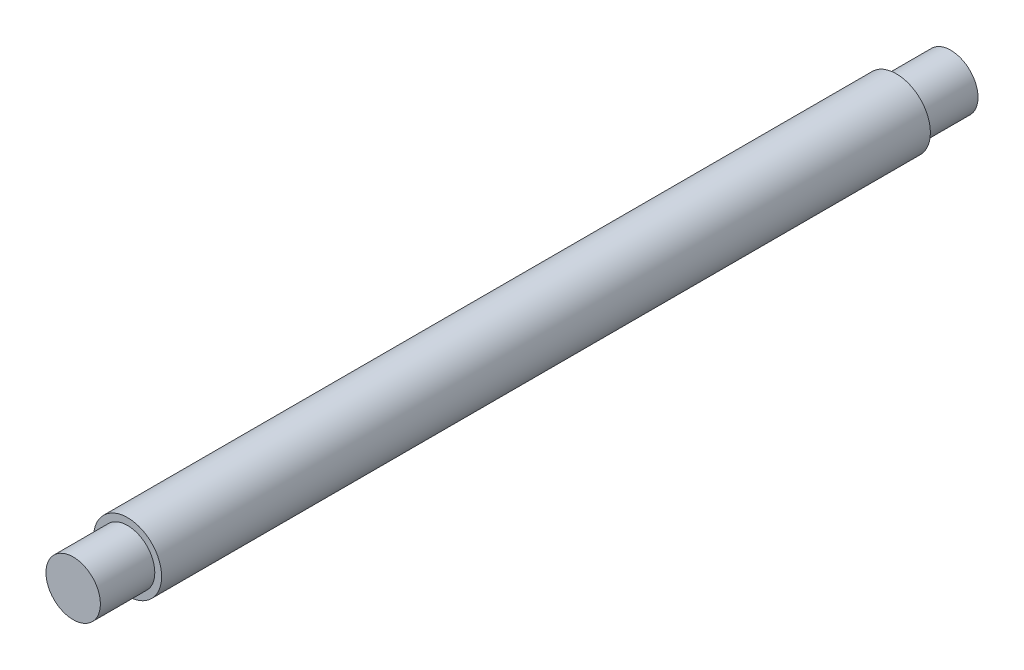
ISO-10303-21;
HEADER;
FILE_DESCRIPTION(('STEP AP214'),'2;1');
FILE_NAME('part.step','',(''),(''),'','','');
FILE_SCHEMA(('AUTOMOTIVE_DESIGN { 1 0 10303 214 1 1 1 1 }'));
ENDSEC;
DATA;
#1=APPLICATION_CONTEXT('core data for automotive mechanical design processes');
#2=APPLICATION_PROTOCOL_DEFINITION('international standard','automotive_design',2000,#1);
#3=PRODUCT_CONTEXT('',#1,'mechanical');
#4=PRODUCT('Part','Part','',(#3));
#5=PRODUCT_RELATED_PRODUCT_CATEGORY('part','',(#4));
#6=PRODUCT_DEFINITION_FORMATION('','',#4);
#7=PRODUCT_DEFINITION_CONTEXT('part definition',#1,'design');
#8=PRODUCT_DEFINITION('design','',#6,#7);
#9=PRODUCT_DEFINITION_SHAPE('','',#8);
#10=(LENGTH_UNIT() NAMED_UNIT(*) SI_UNIT(.MILLI.,.METRE.));
#11=(NAMED_UNIT(*) PLANE_ANGLE_UNIT() SI_UNIT($,.RADIAN.));
#12=(NAMED_UNIT(*) SI_UNIT($,.STERADIAN.) SOLID_ANGLE_UNIT());
#13=UNCERTAINTY_MEASURE_WITH_UNIT(LENGTH_MEASURE(1.E-05),#10,'distance_accuracy_value','');
#14=(GEOMETRIC_REPRESENTATION_CONTEXT(3) GLOBAL_UNCERTAINTY_ASSIGNED_CONTEXT((#13)) GLOBAL_UNIT_ASSIGNED_CONTEXT((#10,
#11,#12)) REPRESENTATION_CONTEXT('',''));
#15=CARTESIAN_POINT('',(0.,0.,0.));
#16=DIRECTION('',(0.,0.,1.));
#17=DIRECTION('',(1.,0.,0.));
#18=AXIS2_PLACEMENT_3D('',#15,#16,#17);
#19=CARTESIAN_POINT('',(0.,0.,56.5));
#20=DIRECTION('',(0.,0.,-1.));
#21=DIRECTION('',(-1.,0.,0.));
#22=AXIS2_PLACEMENT_3D('',#19,#20,#21);
#23=CYLINDRICAL_SURFACE('',#22,5.);
#24=CARTESIAN_POINT('',(0.,0.,56.5));
#25=DIRECTION('',(0.,0.,1.));
#26=DIRECTION('',(1.,0.,0.));
#27=AXIS2_PLACEMENT_3D('',#24,#25,#26);
#28=CIRCLE('',#27,5.);
#29=CARTESIAN_POINT('',(5.,0.,56.5));
#30=VERTEX_POINT('',#29);
#31=EDGE_CURVE('E43',#30,#30,#28,.T.);
#32=ORIENTED_EDGE('',*,*,#31,.F.);
#33=EDGE_LOOP('',(#32));
#34=FACE_BOUND('',#33,.T.);
#35=CARTESIAN_POINT('',(0.,0.,-56.5));
#36=DIRECTION('',(0.,0.,1.));
#37=DIRECTION('',(1.,0.,0.));
#38=AXIS2_PLACEMENT_3D('',#35,#36,#37);
#39=CIRCLE('',#38,5.);
#40=CARTESIAN_POINT('',(5.,0.,-56.5));
#41=VERTEX_POINT('',#40);
#42=EDGE_CURVE('E47',#41,#41,#39,.T.);
#43=ORIENTED_EDGE('',*,*,#42,.T.);
#44=EDGE_LOOP('',(#43));
#45=FACE_BOUND('',#44,.T.);
#46=ADVANCED_FACE('F37',(#34,#45),#23,.T.);
#47=CARTESIAN_POINT('',(0.,0.,56.5));
#48=DIRECTION('',(0.,0.,1.));
#49=DIRECTION('',(1.,0.,0.));
#50=AXIS2_PLACEMENT_3D('',#47,#48,#49);
#51=PLANE('',#50);
#52=CARTESIAN_POINT('',(0.,0.,56.5));
#53=DIRECTION('',(0.,0.,1.));
#54=DIRECTION('',(1.,0.,0.));
#55=AXIS2_PLACEMENT_3D('',#52,#53,#54);
#56=CIRCLE('',#55,4.);
#57=CARTESIAN_POINT('',(4.,0.,56.5));
#58=VERTEX_POINT('',#57);
#59=EDGE_CURVE('E52',#58,#58,#56,.F.);
#60=ORIENTED_EDGE('',*,*,#59,.T.);
#61=EDGE_LOOP('',(#60));
#62=FACE_BOUND('',#61,.T.);
#63=ORIENTED_EDGE('',*,*,#31,.T.);
#64=EDGE_LOOP('',(#63));
#65=FACE_BOUND('',#64,.T.);
#66=ADVANCED_FACE('F81',(#62,#65),#51,.T.);
#67=CARTESIAN_POINT('',(0.,0.,-56.5));
#68=DIRECTION('',(0.,0.,1.));
#69=DIRECTION('',(1.,0.,0.));
#70=AXIS2_PLACEMENT_3D('',#67,#68,#69);
#71=PLANE('',#70);
#72=CARTESIAN_POINT('',(0.,0.,-56.5));
#73=DIRECTION('',(0.,0.,1.));
#74=DIRECTION('',(1.,0.,0.));
#75=AXIS2_PLACEMENT_3D('',#72,#73,#74);
#76=CIRCLE('',#75,4.);
#77=CARTESIAN_POINT('',(4.,0.,-56.5));
#78=VERTEX_POINT('',#77);
#79=EDGE_CURVE('E10',#78,#78,#76,.F.);
#80=ORIENTED_EDGE('',*,*,#79,.F.);
#81=EDGE_LOOP('',(#80));
#82=FACE_BOUND('',#81,.T.);
#83=ORIENTED_EDGE('',*,*,#42,.F.);
#84=EDGE_LOOP('',(#83));
#85=FACE_BOUND('',#84,.T.);
#86=ADVANCED_FACE('F86',(#82,#85),#71,.F.);
#87=CARTESIAN_POINT('',(0.,0.,-64.5));
#88=DIRECTION('',(0.,0.,1.));
#89=DIRECTION('',(1.,0.,0.));
#90=AXIS2_PLACEMENT_3D('',#87,#88,#89);
#91=PLANE('',#90);
#92=CARTESIAN_POINT('',(0.,0.,-64.5));
#93=DIRECTION('',(0.,0.,1.));
#94=DIRECTION('',(1.,0.,0.));
#95=AXIS2_PLACEMENT_3D('',#92,#93,#94);
#96=CIRCLE('',#95,4.);
#97=CARTESIAN_POINT('',(4.,0.,-64.5));
#98=VERTEX_POINT('',#97);
#99=EDGE_CURVE('E57',#98,#98,#96,.T.);
#100=ORIENTED_EDGE('',*,*,#99,.F.);
#101=EDGE_LOOP('',(#100));
#102=FACE_BOUND('',#101,.T.);
#103=ADVANCED_FACE('F75',(#102),#91,.F.);
#104=CARTESIAN_POINT('',(0.,0.,64.5));
#105=DIRECTION('',(0.,0.,-1.));
#106=DIRECTION('',(-1.,0.,0.));
#107=AXIS2_PLACEMENT_3D('',#104,#105,#106);
#108=CYLINDRICAL_SURFACE('',#107,4.);
#109=ORIENTED_EDGE('',*,*,#99,.T.);
#110=EDGE_LOOP('',(#109));
#111=FACE_BOUND('',#110,.T.);
#112=ORIENTED_EDGE('',*,*,#79,.T.);
#113=EDGE_LOOP('',(#112));
#114=FACE_BOUND('',#113,.T.);
#115=ADVANCED_FACE('F67',(#111,#114),#108,.T.);
#116=ORIENTED_EDGE('',*,*,#59,.F.);
#117=EDGE_LOOP('',(#116));
#118=FACE_BOUND('',#117,.T.);
#119=CARTESIAN_POINT('',(0.,0.,64.5));
#120=DIRECTION('',(0.,0.,1.));
#121=DIRECTION('',(1.,0.,0.));
#122=AXIS2_PLACEMENT_3D('',#119,#120,#121);
#123=CIRCLE('',#122,4.);
#124=CARTESIAN_POINT('',(4.,0.,64.5));
#125=VERTEX_POINT('',#124);
#126=EDGE_CURVE('E56',#125,#125,#123,.T.);
#127=ORIENTED_EDGE('',*,*,#126,.F.);
#128=EDGE_LOOP('',(#127));
#129=FACE_BOUND('',#128,.T.);
#130=ADVANCED_FACE('F65',(#118,#129),#108,.T.);
#131=CARTESIAN_POINT('',(0.,0.,64.5));
#132=DIRECTION('',(0.,0.,1.));
#133=DIRECTION('',(1.,0.,0.));
#134=AXIS2_PLACEMENT_3D('',#131,#132,#133);
#135=PLANE('',#134);
#136=ORIENTED_EDGE('',*,*,#126,.T.);
#137=EDGE_LOOP('',(#136));
#138=FACE_BOUND('',#137,.T.);
#139=ADVANCED_FACE('F63',(#138),#135,.T.);
#140=CLOSED_SHELL('',(#46,#66,#86,#103,#115,#130,#139));
#141=MANIFOLD_SOLID_BREP('B2',#140);
#142=ADVANCED_BREP_SHAPE_REPRESENTATION('',(#18,#141),#14);
#143=SHAPE_DEFINITION_REPRESENTATION(#9,#142);
ENDSEC;
END-ISO-10303-21;
